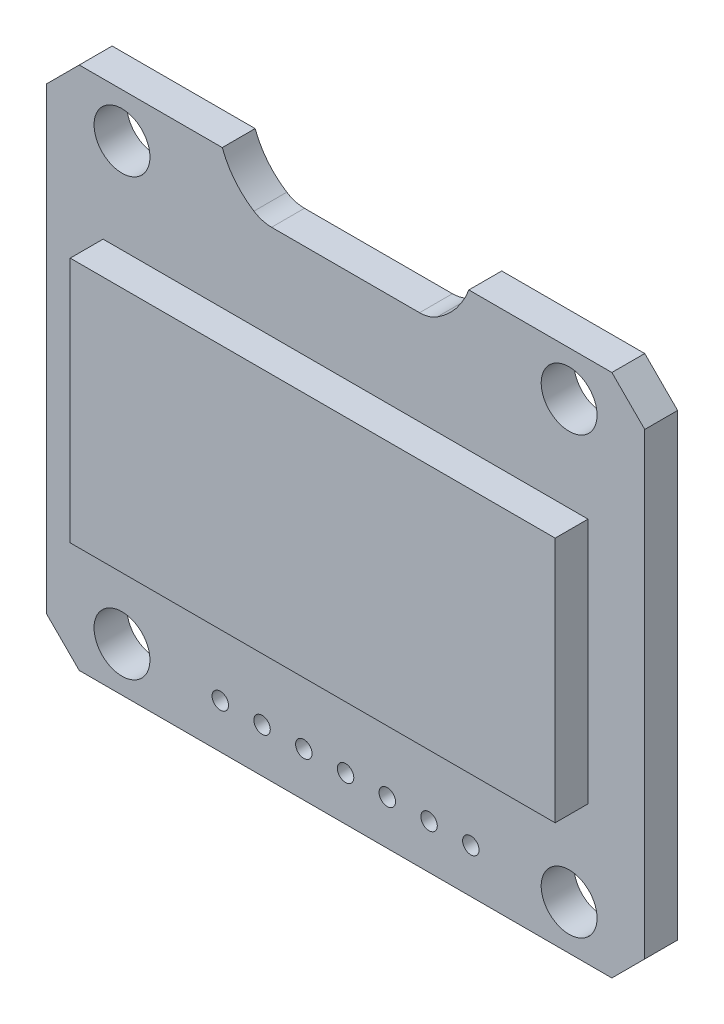
ISO-10303-21;
HEADER;
FILE_DESCRIPTION(('STEP AP214'),'2;1');
FILE_NAME('part.step','',(''),(''),'','','');
FILE_SCHEMA(('AUTOMOTIVE_DESIGN { 1 0 10303 214 1 1 1 1 }'));
ENDSEC;
DATA;
#1=APPLICATION_CONTEXT('core data for automotive mechanical design processes');
#2=APPLICATION_PROTOCOL_DEFINITION('international standard','automotive_design',2000,#1);
#3=PRODUCT_CONTEXT('',#1,'mechanical');
#4=PRODUCT('Part','Part','',(#3));
#5=PRODUCT_RELATED_PRODUCT_CATEGORY('part','',(#4));
#6=PRODUCT_DEFINITION_FORMATION('','',#4);
#7=PRODUCT_DEFINITION_CONTEXT('part definition',#1,'design');
#8=PRODUCT_DEFINITION('design','',#6,#7);
#9=PRODUCT_DEFINITION_SHAPE('','',#8);
#10=(LENGTH_UNIT() NAMED_UNIT(*) SI_UNIT(.MILLI.,.METRE.));
#11=(NAMED_UNIT(*) PLANE_ANGLE_UNIT() SI_UNIT($,.RADIAN.));
#12=(NAMED_UNIT(*) SI_UNIT($,.STERADIAN.) SOLID_ANGLE_UNIT());
#13=UNCERTAINTY_MEASURE_WITH_UNIT(LENGTH_MEASURE(1.E-05),#10,'distance_accuracy_value','');
#14=(GEOMETRIC_REPRESENTATION_CONTEXT(3) GLOBAL_UNCERTAINTY_ASSIGNED_CONTEXT((#13)) GLOBAL_UNIT_ASSIGNED_CONTEXT((#10,
#11,#12)) REPRESENTATION_CONTEXT('',''));
#15=CARTESIAN_POINT('',(0.,0.,0.));
#16=DIRECTION('',(0.,0.,1.));
#17=DIRECTION('',(1.,0.,0.));
#18=AXIS2_PLACEMENT_3D('',#15,#16,#17);
#19=CARTESIAN_POINT('',(-18.2,15.95,2.));
#20=DIRECTION('',(0.,-1.,0.));
#21=DIRECTION('',(0.,0.,-1.));
#22=AXIS2_PLACEMENT_3D('',#19,#20,#21);
#23=PLANE('',#22);
#24=DIRECTION('',(-1.,0.,0.));
#25=VECTOR('',#24,1.);
#26=CARTESIAN_POINT('',(-18.2,15.95,2.));
#27=LINE('',#26,#25);
#28=CARTESIAN_POINT('',(-7.5,15.95,2.));
#29=VERTEX_POINT('',#28);
#30=CARTESIAN_POINT('',(-16.2,15.95,2.));
#31=VERTEX_POINT('',#30);
#32=EDGE_CURVE('E191',#29,#31,#27,.T.);
#33=ORIENTED_EDGE('',*,*,#32,.F.);
#34=DIRECTION('',(0.,0.,1.));
#35=VECTOR('',#34,1.);
#36=CARTESIAN_POINT('',(-7.5,15.95,-8.));
#37=LINE('',#36,#35);
#38=CARTESIAN_POINT('',(-7.5,15.95,0.));
#39=VERTEX_POINT('',#38);
#40=EDGE_CURVE('E182',#39,#29,#37,.T.);
#41=ORIENTED_EDGE('',*,*,#40,.F.);
#42=DIRECTION('',(-1.,0.,0.));
#43=VECTOR('',#42,1.);
#44=CARTESIAN_POINT('',(-18.2,15.95,0.));
#45=LINE('',#44,#43);
#46=CARTESIAN_POINT('',(-16.2,15.95,0.));
#47=VERTEX_POINT('',#46);
#48=EDGE_CURVE('E206',#39,#47,#45,.T.);
#49=ORIENTED_EDGE('',*,*,#48,.T.);
#50=DIRECTION('',(0.,0.,1.));
#51=VECTOR('',#50,1.);
#52=CARTESIAN_POINT('',(-16.2,15.95,0.));
#53=LINE('',#52,#51);
#54=EDGE_CURVE('E328',#47,#31,#53,.T.);
#55=ORIENTED_EDGE('',*,*,#54,.T.);
#56=EDGE_LOOP('',(#33,#41,#49,#55));
#57=FACE_BOUND('',#56,.T.);
#58=ADVANCED_FACE('F41',(#57),#23,.F.);
#59=CARTESIAN_POINT('',(0.,0.,2.));
#60=DIRECTION('',(0.,0.,-1.));
#61=DIRECTION('',(-1.,0.,0.));
#62=AXIS2_PLACEMENT_3D('',#59,#60,#61);
#63=PLANE('',#62);
#64=CARTESIAN_POINT('',(-7.62,-13.25,2.));
#65=DIRECTION('',(0.,0.,1.));
#66=DIRECTION('',(1.,0.,0.));
#67=AXIS2_PLACEMENT_3D('',#64,#65,#66);
#68=CIRCLE('',#67,0.500000000000001);
#69=CARTESIAN_POINT('',(-7.12,-13.25,2.));
#70=VERTEX_POINT('',#69);
#71=EDGE_CURVE('E219',#70,#70,#68,.T.);
#72=ORIENTED_EDGE('',*,*,#71,.F.);
#73=EDGE_LOOP('',(#72));
#74=FACE_BOUND('',#73,.T.);
#75=CARTESIAN_POINT('',(-5.08,-13.25,2.));
#76=DIRECTION('',(0.,0.,1.));
#77=DIRECTION('',(1.,0.,0.));
#78=AXIS2_PLACEMENT_3D('',#75,#76,#77);
#79=CIRCLE('',#78,0.500000000000001);
#80=CARTESIAN_POINT('',(-4.58,-13.25,2.));
#81=VERTEX_POINT('',#80);
#82=EDGE_CURVE('E452',#81,#81,#79,.T.);
#83=ORIENTED_EDGE('',*,*,#82,.F.);
#84=EDGE_LOOP('',(#83));
#85=FACE_BOUND('',#84,.T.);
#86=CARTESIAN_POINT('',(-2.54,-13.25,2.));
#87=DIRECTION('',(0.,0.,1.));
#88=DIRECTION('',(1.,0.,0.));
#89=AXIS2_PLACEMENT_3D('',#86,#87,#88);
#90=CIRCLE('',#89,0.500000000000001);
#91=CARTESIAN_POINT('',(-2.04,-13.25,2.));
#92=VERTEX_POINT('',#91);
#93=EDGE_CURVE('E449',#92,#92,#90,.T.);
#94=ORIENTED_EDGE('',*,*,#93,.F.);
#95=EDGE_LOOP('',(#94));
#96=FACE_BOUND('',#95,.T.);
#97=CARTESIAN_POINT('',(0.,-13.25,2.));
#98=DIRECTION('',(0.,0.,1.));
#99=DIRECTION('',(1.,0.,0.));
#100=AXIS2_PLACEMENT_3D('',#97,#98,#99);
#101=CIRCLE('',#100,0.500000000000001);
#102=CARTESIAN_POINT('',(0.500000000000003,-13.25,2.));
#103=VERTEX_POINT('',#102);
#104=EDGE_CURVE('E446',#103,#103,#101,.T.);
#105=ORIENTED_EDGE('',*,*,#104,.F.);
#106=EDGE_LOOP('',(#105));
#107=FACE_BOUND('',#106,.T.);
#108=CARTESIAN_POINT('',(2.54,-13.25,2.));
#109=DIRECTION('',(0.,0.,1.));
#110=DIRECTION('',(1.,0.,0.));
#111=AXIS2_PLACEMENT_3D('',#108,#109,#110);
#112=CIRCLE('',#111,0.500000000000001);
#113=CARTESIAN_POINT('',(3.04,-13.25,2.));
#114=VERTEX_POINT('',#113);
#115=EDGE_CURVE('E443',#114,#114,#112,.T.);
#116=ORIENTED_EDGE('',*,*,#115,.F.);
#117=EDGE_LOOP('',(#116));
#118=FACE_BOUND('',#117,.T.);
#119=CARTESIAN_POINT('',(5.08,-13.25,2.));
#120=DIRECTION('',(0.,0.,1.));
#121=DIRECTION('',(1.,0.,0.));
#122=AXIS2_PLACEMENT_3D('',#119,#120,#121);
#123=CIRCLE('',#122,0.500000000000001);
#124=CARTESIAN_POINT('',(5.58,-13.25,2.));
#125=VERTEX_POINT('',#124);
#126=EDGE_CURVE('E440',#125,#125,#123,.T.);
#127=ORIENTED_EDGE('',*,*,#126,.F.);
#128=EDGE_LOOP('',(#127));
#129=FACE_BOUND('',#128,.T.);
#130=CARTESIAN_POINT('',(7.62,-13.25,2.));
#131=DIRECTION('',(0.,0.,1.));
#132=DIRECTION('',(1.,0.,0.));
#133=AXIS2_PLACEMENT_3D('',#130,#131,#132);
#134=CIRCLE('',#133,0.500000000000001);
#135=CARTESIAN_POINT('',(8.12,-13.25,2.));
#136=VERTEX_POINT('',#135);
#137=EDGE_CURVE('E437',#136,#136,#134,.T.);
#138=ORIENTED_EDGE('',*,*,#137,.F.);
#139=EDGE_LOOP('',(#138));
#140=FACE_BOUND('',#139,.T.);
#141=CARTESIAN_POINT('',(-13.6,-13.25,2.));
#142=DIRECTION('',(0.,0.,1.));
#143=DIRECTION('',(-1.,0.,0.));
#144=AXIS2_PLACEMENT_3D('',#141,#142,#143);
#145=CIRCLE('',#144,1.7);
#146=CARTESIAN_POINT('',(-15.3,-13.25,2.));
#147=VERTEX_POINT('',#146);
#148=EDGE_CURVE('E346',#147,#147,#145,.T.);
#149=ORIENTED_EDGE('',*,*,#148,.F.);
#150=EDGE_LOOP('',(#149));
#151=FACE_BOUND('',#150,.T.);
#152=CARTESIAN_POINT('',(13.6,-13.25,2.));
#153=DIRECTION('',(0.,0.,1.));
#154=DIRECTION('',(1.,0.,0.));
#155=AXIS2_PLACEMENT_3D('',#152,#153,#154);
#156=CIRCLE('',#155,1.7);
#157=CARTESIAN_POINT('',(15.3,-13.25,2.));
#158=VERTEX_POINT('',#157);
#159=EDGE_CURVE('E340',#158,#158,#156,.T.);
#160=ORIENTED_EDGE('',*,*,#159,.F.);
#161=EDGE_LOOP('',(#160));
#162=FACE_BOUND('',#161,.T.);
#163=CARTESIAN_POINT('',(13.6,13.25,2.));
#164=DIRECTION('',(0.,0.,1.));
#165=DIRECTION('',(-1.,0.,0.));
#166=AXIS2_PLACEMENT_3D('',#163,#164,#165);
#167=CIRCLE('',#166,1.7);
#168=CARTESIAN_POINT('',(11.9,13.25,2.));
#169=VERTEX_POINT('',#168);
#170=EDGE_CURVE('E333',#169,#169,#167,.T.);
#171=ORIENTED_EDGE('',*,*,#170,.F.);
#172=EDGE_LOOP('',(#171));
#173=FACE_BOUND('',#172,.T.);
#174=CARTESIAN_POINT('',(-13.6,13.25,2.));
#175=DIRECTION('',(0.,0.,1.));
#176=DIRECTION('',(1.,0.,0.));
#177=AXIS2_PLACEMENT_3D('',#174,#175,#176);
#178=CIRCLE('',#177,1.7);
#179=CARTESIAN_POINT('',(-11.9,13.25,2.));
#180=VERTEX_POINT('',#179);
#181=EDGE_CURVE('E336',#180,#180,#178,.T.);
#182=ORIENTED_EDGE('',*,*,#181,.F.);
#183=EDGE_LOOP('',(#182));
#184=FACE_BOUND('',#183,.T.);
#185=DIRECTION('',(1.,0.,0.));
#186=VECTOR('',#185,1.);
#187=CARTESIAN_POINT('',(-5.,13.25,2.));
#188=LINE('',#187,#186);
#189=CARTESIAN_POINT('',(-4.50080011335944,13.25,2.));
#190=VERTEX_POINT('',#189);
#191=CARTESIAN_POINT('',(4.50080011335943,13.25,2.));
#192=VERTEX_POINT('',#191);
#193=EDGE_CURVE('E172',#190,#192,#188,.T.);
#194=ORIENTED_EDGE('',*,*,#193,.F.);
#195=CARTESIAN_POINT('',(-4.50080011335943,15.25,2.));
#196=DIRECTION('',(0.,0.,-1.));
#197=DIRECTION('',(-1.,0.,0.));
#198=AXIS2_PLACEMENT_3D('',#195,#196,#197);
#199=CIRCLE('',#198,2.);
#200=CARTESIAN_POINT('',(-5.5742727633345,13.5624999348873,2.));
#201=VERTEX_POINT('',#200);
#202=EDGE_CURVE('E252',#190,#201,#199,.T.);
#203=ORIENTED_EDGE('',*,*,#202,.T.);
#204=CARTESIAN_POINT('',(-3.,17.6092592592593,2.));
#205=DIRECTION('',(0.,0.,1.));
#206=DIRECTION('',(1.,0.,0.));
#207=AXIS2_PLACEMENT_3D('',#204,#205,#206);
#208=CIRCLE('',#207,4.79615901419434);
#209=EDGE_CURVE('E259',#29,#201,#208,.T.);
#210=ORIENTED_EDGE('',*,*,#209,.F.);
#211=ORIENTED_EDGE('',*,*,#32,.T.);
#212=DIRECTION('',(0.707106781186547,0.707106781186548,0.));
#213=VECTOR('',#212,1.);
#214=CARTESIAN_POINT('',(-16.2,15.95,2.));
#215=LINE('',#214,#213);
#216=CARTESIAN_POINT('',(-18.2,13.95,2.));
#217=VERTEX_POINT('',#216);
#218=EDGE_CURVE('E325',#217,#31,#215,.T.);
#219=ORIENTED_EDGE('',*,*,#218,.F.);
#220=DIRECTION('',(0.,-1.,0.));
#221=VECTOR('',#220,1.);
#222=CARTESIAN_POINT('',(-18.2,-15.95,2.));
#223=LINE('',#222,#221);
#224=CARTESIAN_POINT('',(-18.2,-13.95,2.));
#225=VERTEX_POINT('',#224);
#226=EDGE_CURVE('E190',#217,#225,#223,.T.);
#227=ORIENTED_EDGE('',*,*,#226,.T.);
#228=DIRECTION('',(-0.707106781186547,0.707106781186548,0.));
#229=VECTOR('',#228,1.);
#230=CARTESIAN_POINT('',(-16.2,-15.95,2.));
#231=LINE('',#230,#229);
#232=CARTESIAN_POINT('',(-16.2,-15.95,2.));
#233=VERTEX_POINT('',#232);
#234=EDGE_CURVE('E317',#233,#225,#231,.T.);
#235=ORIENTED_EDGE('',*,*,#234,.F.);
#236=DIRECTION('',(1.,0.,0.));
#237=VECTOR('',#236,1.);
#238=CARTESIAN_POINT('',(-18.2,-15.95,2.));
#239=LINE('',#238,#237);
#240=CARTESIAN_POINT('',(16.2,-15.95,2.));
#241=VERTEX_POINT('',#240);
#242=EDGE_CURVE('E194',#233,#241,#239,.T.);
#243=ORIENTED_EDGE('',*,*,#242,.T.);
#244=DIRECTION('',(-0.707106781186547,-0.707106781186548,0.));
#245=VECTOR('',#244,1.);
#246=CARTESIAN_POINT('',(16.2,-15.95,2.));
#247=LINE('',#246,#245);
#248=CARTESIAN_POINT('',(18.2,-13.95,2.));
#249=VERTEX_POINT('',#248);
#250=EDGE_CURVE('E297',#249,#241,#247,.T.);
#251=ORIENTED_EDGE('',*,*,#250,.F.);
#252=DIRECTION('',(0.,1.,0.));
#253=VECTOR('',#252,1.);
#254=CARTESIAN_POINT('',(18.2,-15.95,2.));
#255=LINE('',#254,#253);
#256=CARTESIAN_POINT('',(18.2,13.95,2.));
#257=VERTEX_POINT('',#256);
#258=EDGE_CURVE('E196',#249,#257,#255,.T.);
#259=ORIENTED_EDGE('',*,*,#258,.T.);
#260=DIRECTION('',(0.707106781186547,-0.707106781186548,0.));
#261=VECTOR('',#260,1.);
#262=CARTESIAN_POINT('',(16.2,15.95,2.));
#263=LINE('',#262,#261);
#264=CARTESIAN_POINT('',(16.2,15.95,2.));
#265=VERTEX_POINT('',#264);
#266=EDGE_CURVE('E189',#265,#257,#263,.T.);
#267=ORIENTED_EDGE('',*,*,#266,.F.);
#268=CARTESIAN_POINT('',(7.5,15.95,2.));
#269=VERTEX_POINT('',#268);
#270=EDGE_CURVE('E179',#265,#269,#27,.T.);
#271=ORIENTED_EDGE('',*,*,#270,.T.);
#272=CARTESIAN_POINT('',(3.,17.6092592592593,2.));
#273=DIRECTION('',(0.,0.,1.));
#274=DIRECTION('',(-1.,0.,0.));
#275=AXIS2_PLACEMENT_3D('',#272,#273,#274);
#276=CIRCLE('',#275,4.79615901419434);
#277=CARTESIAN_POINT('',(5.5742727633345,13.5624999348873,2.));
#278=VERTEX_POINT('',#277);
#279=EDGE_CURVE('E165',#278,#269,#276,.T.);
#280=ORIENTED_EDGE('',*,*,#279,.F.);
#281=CARTESIAN_POINT('',(4.50080011335944,15.25,2.));
#282=DIRECTION('',(0.,0.,-1.));
#283=DIRECTION('',(-1.,0.,0.));
#284=AXIS2_PLACEMENT_3D('',#281,#282,#283);
#285=CIRCLE('',#284,2.);
#286=EDGE_CURVE('E49',#278,#192,#285,.T.);
#287=ORIENTED_EDGE('',*,*,#286,.T.);
#288=EDGE_LOOP('',(#194,#203,#210,#211,#219,#227,#235,#243,#251,#259,#267,#271,#280,#287));
#289=FACE_BOUND('',#288,.T.);
#290=DIRECTION('',(0.,1.,0.));
#291=VECTOR('',#290,1.);
#292=CARTESIAN_POINT('',(14.75,-7.5,2.));
#293=LINE('',#292,#291);
#294=CARTESIAN_POINT('',(14.75,-7.5,2.));
#295=VERTEX_POINT('',#294);
#296=CARTESIAN_POINT('',(14.75,7.5,2.));
#297=VERTEX_POINT('',#296);
#298=EDGE_CURVE('E354',#295,#297,#293,.T.);
#299=ORIENTED_EDGE('',*,*,#298,.F.);
#300=DIRECTION('',(1.,0.,0.));
#301=VECTOR('',#300,1.);
#302=CARTESIAN_POINT('',(-14.75,-7.5,2.));
#303=LINE('',#302,#301);
#304=CARTESIAN_POINT('',(-14.75,-7.5,2.));
#305=VERTEX_POINT('',#304);
#306=EDGE_CURVE('E361',#305,#295,#303,.T.);
#307=ORIENTED_EDGE('',*,*,#306,.F.);
#308=DIRECTION('',(0.,-1.,0.));
#309=VECTOR('',#308,1.);
#310=CARTESIAN_POINT('',(-14.75,-7.5,2.));
#311=LINE('',#310,#309);
#312=CARTESIAN_POINT('',(-14.75,7.5,2.));
#313=VERTEX_POINT('',#312);
#314=EDGE_CURVE('E373',#313,#305,#311,.T.);
#315=ORIENTED_EDGE('',*,*,#314,.F.);
#316=DIRECTION('',(-1.,0.,0.));
#317=VECTOR('',#316,1.);
#318=CARTESIAN_POINT('',(-14.75,7.5,2.));
#319=LINE('',#318,#317);
#320=EDGE_CURVE('E370',#297,#313,#319,.T.);
#321=ORIENTED_EDGE('',*,*,#320,.F.);
#322=EDGE_LOOP('',(#299,#307,#315,#321));
#323=FACE_BOUND('',#322,.T.);
#324=ADVANCED_FACE('F186',(#74,#85,#96,#107,#118,#129,#140,#151,#162,#173,#184,#289,#323),#63,.F.);
#325=CARTESIAN_POINT('',(18.2,-15.95,2.));
#326=DIRECTION('',(-1.,0.,0.));
#327=DIRECTION('',(0.,0.,1.));
#328=AXIS2_PLACEMENT_3D('',#325,#326,#327);
#329=PLANE('',#328);
#330=ORIENTED_EDGE('',*,*,#258,.F.);
#331=DIRECTION('',(0.,0.,1.));
#332=VECTOR('',#331,1.);
#333=CARTESIAN_POINT('',(18.2,-13.95,0.));
#334=LINE('',#333,#332);
#335=CARTESIAN_POINT('',(18.2,-13.95,0.));
#336=VERTEX_POINT('',#335);
#337=EDGE_CURVE('E293',#336,#249,#334,.T.);
#338=ORIENTED_EDGE('',*,*,#337,.F.);
#339=DIRECTION('',(0.,1.,0.));
#340=VECTOR('',#339,1.);
#341=CARTESIAN_POINT('',(18.2,-15.95,0.));
#342=LINE('',#341,#340);
#343=CARTESIAN_POINT('',(18.2,13.95,0.));
#344=VERTEX_POINT('',#343);
#345=EDGE_CURVE('E203',#336,#344,#342,.T.);
#346=ORIENTED_EDGE('',*,*,#345,.T.);
#347=DIRECTION('',(0.,0.,1.));
#348=VECTOR('',#347,1.);
#349=CARTESIAN_POINT('',(18.2,13.95,0.));
#350=LINE('',#349,#348);
#351=EDGE_CURVE('E295',#344,#257,#350,.T.);
#352=ORIENTED_EDGE('',*,*,#351,.T.);
#353=EDGE_LOOP('',(#330,#338,#346,#352));
#354=FACE_BOUND('',#353,.T.);
#355=ADVANCED_FACE('F273',(#354),#329,.F.);
#356=CARTESIAN_POINT('',(16.2,15.95,0.));
#357=VERTEX_POINT('',#356);
#358=CARTESIAN_POINT('',(7.5,15.95,0.));
#359=VERTEX_POINT('',#358);
#360=EDGE_CURVE('E181',#357,#359,#45,.T.);
#361=ORIENTED_EDGE('',*,*,#360,.T.);
#362=DIRECTION('',(0.,0.,1.));
#363=VECTOR('',#362,1.);
#364=CARTESIAN_POINT('',(7.5,15.95,-8.));
#365=LINE('',#364,#363);
#366=EDGE_CURVE('E168',#359,#269,#365,.T.);
#367=ORIENTED_EDGE('',*,*,#366,.T.);
#368=ORIENTED_EDGE('',*,*,#270,.F.);
#369=DIRECTION('',(0.,0.,1.));
#370=VECTOR('',#369,1.);
#371=CARTESIAN_POINT('',(16.2,15.95,0.));
#372=LINE('',#371,#370);
#373=EDGE_CURVE('E302',#357,#265,#372,.T.);
#374=ORIENTED_EDGE('',*,*,#373,.F.);
#375=EDGE_LOOP('',(#361,#367,#368,#374));
#376=FACE_BOUND('',#375,.T.);
#377=ADVANCED_FACE('F177',(#376),#23,.F.);
#378=CARTESIAN_POINT('',(-18.2,-15.95,2.));
#379=DIRECTION('',(1.,0.,0.));
#380=DIRECTION('',(0.,0.,-1.));
#381=AXIS2_PLACEMENT_3D('',#378,#379,#380);
#382=PLANE('',#381);
#383=DIRECTION('',(0.,-1.,0.));
#384=VECTOR('',#383,1.);
#385=CARTESIAN_POINT('',(-18.2,-15.95,0.));
#386=LINE('',#385,#384);
#387=CARTESIAN_POINT('',(-18.2,13.95,0.));
#388=VERTEX_POINT('',#387);
#389=CARTESIAN_POINT('',(-18.2,-13.95,0.));
#390=VERTEX_POINT('',#389);
#391=EDGE_CURVE('E209',#388,#390,#386,.T.);
#392=ORIENTED_EDGE('',*,*,#391,.T.);
#393=DIRECTION('',(0.,0.,1.));
#394=VECTOR('',#393,1.);
#395=CARTESIAN_POINT('',(-18.2,-13.95,0.));
#396=LINE('',#395,#394);
#397=EDGE_CURVE('E312',#390,#225,#396,.T.);
#398=ORIENTED_EDGE('',*,*,#397,.T.);
#399=ORIENTED_EDGE('',*,*,#226,.F.);
#400=DIRECTION('',(0.,0.,1.));
#401=VECTOR('',#400,1.);
#402=CARTESIAN_POINT('',(-18.2,13.95,0.));
#403=LINE('',#402,#401);
#404=EDGE_CURVE('E324',#388,#217,#403,.T.);
#405=ORIENTED_EDGE('',*,*,#404,.F.);
#406=EDGE_LOOP('',(#392,#398,#399,#405));
#407=FACE_BOUND('',#406,.T.);
#408=ADVANCED_FACE('F280',(#407),#382,.F.);
#409=CARTESIAN_POINT('',(-18.2,-15.95,2.));
#410=DIRECTION('',(0.,1.,0.));
#411=DIRECTION('',(0.,0.,1.));
#412=AXIS2_PLACEMENT_3D('',#409,#410,#411);
#413=PLANE('',#412);
#414=ORIENTED_EDGE('',*,*,#242,.F.);
#415=DIRECTION('',(0.,0.,1.));
#416=VECTOR('',#415,1.);
#417=CARTESIAN_POINT('',(-16.2,-15.95,0.));
#418=LINE('',#417,#416);
#419=CARTESIAN_POINT('',(-16.2,-15.95,0.));
#420=VERTEX_POINT('',#419);
#421=EDGE_CURVE('E237',#420,#233,#418,.T.);
#422=ORIENTED_EDGE('',*,*,#421,.F.);
#423=DIRECTION('',(1.,0.,0.));
#424=VECTOR('',#423,1.);
#425=CARTESIAN_POINT('',(-18.2,-15.95,0.));
#426=LINE('',#425,#424);
#427=CARTESIAN_POINT('',(16.2,-15.95,0.));
#428=VERTEX_POINT('',#427);
#429=EDGE_CURVE('E212',#420,#428,#426,.T.);
#430=ORIENTED_EDGE('',*,*,#429,.T.);
#431=DIRECTION('',(0.,0.,1.));
#432=VECTOR('',#431,1.);
#433=CARTESIAN_POINT('',(16.2,-15.95,0.));
#434=LINE('',#433,#432);
#435=EDGE_CURVE('E309',#428,#241,#434,.T.);
#436=ORIENTED_EDGE('',*,*,#435,.T.);
#437=EDGE_LOOP('',(#414,#422,#430,#436));
#438=FACE_BOUND('',#437,.T.);
#439=ADVANCED_FACE('F285',(#438),#413,.F.);
#440=CARTESIAN_POINT('',(0.,0.,0.));
#441=DIRECTION('',(0.,0.,-1.));
#442=DIRECTION('',(-1.,0.,0.));
#443=AXIS2_PLACEMENT_3D('',#440,#441,#442);
#444=PLANE('',#443);
#445=CARTESIAN_POINT('',(-3.,17.6092592592593,0.));
#446=DIRECTION('',(0.,0.,-1.));
#447=DIRECTION('',(-1.,0.,0.));
#448=AXIS2_PLACEMENT_3D('',#445,#446,#447);
#449=CIRCLE('',#448,4.79615901419434);
#450=CARTESIAN_POINT('',(-5.5742727633345,13.5624999348873,0.));
#451=VERTEX_POINT('',#450);
#452=EDGE_CURVE('E242',#451,#39,#449,.T.);
#453=ORIENTED_EDGE('',*,*,#452,.F.);
#454=CARTESIAN_POINT('',(-4.50080011335943,15.25,0.));
#455=DIRECTION('',(0.,0.,-1.));
#456=DIRECTION('',(-1.,0.,0.));
#457=AXIS2_PLACEMENT_3D('',#454,#455,#456);
#458=CIRCLE('',#457,2.);
#459=CARTESIAN_POINT('',(-4.50080011335944,13.25,0.));
#460=VERTEX_POINT('',#459);
#461=EDGE_CURVE('E254',#451,#460,#458,.F.);
#462=ORIENTED_EDGE('',*,*,#461,.T.);
#463=DIRECTION('',(-1.,0.,0.));
#464=VECTOR('',#463,1.);
#465=CARTESIAN_POINT('',(0.,13.25,0.));
#466=LINE('',#465,#464);
#467=CARTESIAN_POINT('',(4.50080011335943,13.25,0.));
#468=VERTEX_POINT('',#467);
#469=EDGE_CURVE('E202',#468,#460,#466,.T.);
#470=ORIENTED_EDGE('',*,*,#469,.F.);
#471=CARTESIAN_POINT('',(4.50080011335944,15.25,0.));
#472=DIRECTION('',(0.,0.,-1.));
#473=DIRECTION('',(-1.,0.,0.));
#474=AXIS2_PLACEMENT_3D('',#471,#472,#473);
#475=CIRCLE('',#474,2.);
#476=CARTESIAN_POINT('',(5.5742727633345,13.5624999348873,0.));
#477=VERTEX_POINT('',#476);
#478=EDGE_CURVE('E11',#468,#477,#475,.F.);
#479=ORIENTED_EDGE('',*,*,#478,.T.);
#480=CARTESIAN_POINT('',(3.,17.6092592592593,0.));
#481=DIRECTION('',(0.,0.,-1.));
#482=DIRECTION('',(-1.,0.,0.));
#483=AXIS2_PLACEMENT_3D('',#480,#481,#482);
#484=CIRCLE('',#483,4.79615901419434);
#485=EDGE_CURVE('E240',#359,#477,#484,.T.);
#486=ORIENTED_EDGE('',*,*,#485,.F.);
#487=ORIENTED_EDGE('',*,*,#360,.F.);
#488=DIRECTION('',(0.707106781186547,-0.707106781186548,0.));
#489=VECTOR('',#488,1.);
#490=CARTESIAN_POINT('',(16.2,15.95,0.));
#491=LINE('',#490,#489);
#492=EDGE_CURVE('E432',#357,#344,#491,.T.);
#493=ORIENTED_EDGE('',*,*,#492,.T.);
#494=ORIENTED_EDGE('',*,*,#345,.F.);
#495=DIRECTION('',(-0.707106781186547,-0.707106781186548,0.));
#496=VECTOR('',#495,1.);
#497=CARTESIAN_POINT('',(16.2,-15.95,0.));
#498=LINE('',#497,#496);
#499=EDGE_CURVE('E303',#336,#428,#498,.T.);
#500=ORIENTED_EDGE('',*,*,#499,.T.);
#501=ORIENTED_EDGE('',*,*,#429,.F.);
#502=DIRECTION('',(-0.707106781186547,0.707106781186548,0.));
#503=VECTOR('',#502,1.);
#504=CARTESIAN_POINT('',(-16.2,-15.95,0.));
#505=LINE('',#504,#503);
#506=EDGE_CURVE('E315',#420,#390,#505,.T.);
#507=ORIENTED_EDGE('',*,*,#506,.T.);
#508=ORIENTED_EDGE('',*,*,#391,.F.);
#509=DIRECTION('',(0.707106781186547,0.707106781186548,0.));
#510=VECTOR('',#509,1.);
#511=CARTESIAN_POINT('',(-16.2,15.95,0.));
#512=LINE('',#511,#510);
#513=EDGE_CURVE('E321',#388,#47,#512,.T.);
#514=ORIENTED_EDGE('',*,*,#513,.T.);
#515=ORIENTED_EDGE('',*,*,#48,.F.);
#516=EDGE_LOOP('',(#453,#462,#470,#479,#486,#487,#493,#494,#500,#501,#507,#508,#514,#515));
#517=FACE_BOUND('',#516,.T.);
#518=CARTESIAN_POINT('',(-7.62,-13.25,0.));
#519=DIRECTION('',(0.,0.,-1.));
#520=DIRECTION('',(-1.,0.,0.));
#521=AXIS2_PLACEMENT_3D('',#518,#519,#520);
#522=CIRCLE('',#521,0.500000000000001);
#523=CARTESIAN_POINT('',(-8.12,-13.25,0.));
#524=VERTEX_POINT('',#523);
#525=EDGE_CURVE('E234',#524,#524,#522,.T.);
#526=ORIENTED_EDGE('',*,*,#525,.F.);
#527=EDGE_LOOP('',(#526));
#528=FACE_BOUND('',#527,.T.);
#529=CARTESIAN_POINT('',(-5.08,-13.25,0.));
#530=DIRECTION('',(0.,0.,-1.));
#531=DIRECTION('',(-1.,0.,0.));
#532=AXIS2_PLACEMENT_3D('',#529,#530,#531);
#533=CIRCLE('',#532,0.500000000000001);
#534=CARTESIAN_POINT('',(-5.58,-13.25,0.));
#535=VERTEX_POINT('',#534);
#536=EDGE_CURVE('E231',#535,#535,#533,.T.);
#537=ORIENTED_EDGE('',*,*,#536,.F.);
#538=EDGE_LOOP('',(#537));
#539=FACE_BOUND('',#538,.T.);
#540=CARTESIAN_POINT('',(-2.54,-13.25,0.));
#541=DIRECTION('',(0.,0.,-1.));
#542=DIRECTION('',(-1.,0.,0.));
#543=AXIS2_PLACEMENT_3D('',#540,#541,#542);
#544=CIRCLE('',#543,0.500000000000001);
#545=CARTESIAN_POINT('',(-3.04,-13.25,0.));
#546=VERTEX_POINT('',#545);
#547=EDGE_CURVE('E228',#546,#546,#544,.T.);
#548=ORIENTED_EDGE('',*,*,#547,.F.);
#549=EDGE_LOOP('',(#548));
#550=FACE_BOUND('',#549,.T.);
#551=CARTESIAN_POINT('',(0.,-13.25,0.));
#552=DIRECTION('',(0.,0.,-1.));
#553=DIRECTION('',(-1.,0.,0.));
#554=AXIS2_PLACEMENT_3D('',#551,#552,#553);
#555=CIRCLE('',#554,0.500000000000001);
#556=CARTESIAN_POINT('',(-0.5,-13.25,0.));
#557=VERTEX_POINT('',#556);
#558=EDGE_CURVE('E225',#557,#557,#555,.T.);
#559=ORIENTED_EDGE('',*,*,#558,.F.);
#560=EDGE_LOOP('',(#559));
#561=FACE_BOUND('',#560,.T.);
#562=CARTESIAN_POINT('',(2.54,-13.25,0.));
#563=DIRECTION('',(0.,0.,-1.));
#564=DIRECTION('',(-1.,0.,0.));
#565=AXIS2_PLACEMENT_3D('',#562,#563,#564);
#566=CIRCLE('',#565,0.500000000000001);
#567=CARTESIAN_POINT('',(2.04,-13.25,0.));
#568=VERTEX_POINT('',#567);
#569=EDGE_CURVE('E222',#568,#568,#566,.T.);
#570=ORIENTED_EDGE('',*,*,#569,.F.);
#571=EDGE_LOOP('',(#570));
#572=FACE_BOUND('',#571,.T.);
#573=CARTESIAN_POINT('',(5.08,-13.25,0.));
#574=DIRECTION('',(0.,0.,-1.));
#575=DIRECTION('',(-1.,0.,0.));
#576=AXIS2_PLACEMENT_3D('',#573,#574,#575);
#577=CIRCLE('',#576,0.500000000000001);
#578=CARTESIAN_POINT('',(4.58,-13.25,0.));
#579=VERTEX_POINT('',#578);
#580=EDGE_CURVE('E218',#579,#579,#577,.T.);
#581=ORIENTED_EDGE('',*,*,#580,.F.);
#582=EDGE_LOOP('',(#581));
#583=FACE_BOUND('',#582,.T.);
#584=CARTESIAN_POINT('',(7.62,-13.25,0.));
#585=DIRECTION('',(0.,0.,-1.));
#586=DIRECTION('',(-1.,0.,0.));
#587=AXIS2_PLACEMENT_3D('',#584,#585,#586);
#588=CIRCLE('',#587,0.500000000000001);
#589=CARTESIAN_POINT('',(7.12,-13.25,0.));
#590=VERTEX_POINT('',#589);
#591=EDGE_CURVE('E215',#590,#590,#588,.T.);
#592=ORIENTED_EDGE('',*,*,#591,.F.);
#593=EDGE_LOOP('',(#592));
#594=FACE_BOUND('',#593,.T.);
#595=CARTESIAN_POINT('',(-13.6,-13.25,0.));
#596=DIRECTION('',(0.,0.,1.));
#597=DIRECTION('',(-1.,0.,0.));
#598=AXIS2_PLACEMENT_3D('',#595,#596,#597);
#599=CIRCLE('',#598,1.7);
#600=CARTESIAN_POINT('',(-15.3,-13.25,0.));
#601=VERTEX_POINT('',#600);
#602=EDGE_CURVE('E331',#601,#601,#599,.T.);
#603=ORIENTED_EDGE('',*,*,#602,.T.);
#604=EDGE_LOOP('',(#603));
#605=FACE_BOUND('',#604,.T.);
#606=CARTESIAN_POINT('',(13.6,-13.25,0.));
#607=DIRECTION('',(0.,0.,1.));
#608=DIRECTION('',(1.,0.,0.));
#609=AXIS2_PLACEMENT_3D('',#606,#607,#608);
#610=CIRCLE('',#609,1.7);
#611=CARTESIAN_POINT('',(15.3,-13.25,0.));
#612=VERTEX_POINT('',#611);
#613=EDGE_CURVE('E343',#612,#612,#610,.T.);
#614=ORIENTED_EDGE('',*,*,#613,.T.);
#615=EDGE_LOOP('',(#614));
#616=FACE_BOUND('',#615,.T.);
#617=CARTESIAN_POINT('',(13.6,13.25,0.));
#618=DIRECTION('',(0.,0.,1.));
#619=DIRECTION('',(-1.,0.,0.));
#620=AXIS2_PLACEMENT_3D('',#617,#618,#619);
#621=CIRCLE('',#620,1.7);
#622=CARTESIAN_POINT('',(11.9,13.25,0.));
#623=VERTEX_POINT('',#622);
#624=EDGE_CURVE('E337',#623,#623,#621,.T.);
#625=ORIENTED_EDGE('',*,*,#624,.T.);
#626=EDGE_LOOP('',(#625));
#627=FACE_BOUND('',#626,.T.);
#628=CARTESIAN_POINT('',(-13.6,13.25,0.));
#629=DIRECTION('',(0.,0.,1.));
#630=DIRECTION('',(1.,0.,0.));
#631=AXIS2_PLACEMENT_3D('',#628,#629,#630);
#632=CIRCLE('',#631,1.7);
#633=CARTESIAN_POINT('',(-11.9,13.25,0.));
#634=VERTEX_POINT('',#633);
#635=EDGE_CURVE('E351',#634,#634,#632,.T.);
#636=ORIENTED_EDGE('',*,*,#635,.T.);
#637=EDGE_LOOP('',(#636));
#638=FACE_BOUND('',#637,.T.);
#639=ADVANCED_FACE('F421',(#517,#528,#539,#550,#561,#572,#583,#594,#605,#616,#627,#638),#444,.T.);
#640=CARTESIAN_POINT('',(14.75,-7.5,4.));
#641=DIRECTION('',(-1.,0.,0.));
#642=DIRECTION('',(0.,0.,1.));
#643=AXIS2_PLACEMENT_3D('',#640,#641,#642);
#644=PLANE('',#643);
#645=ORIENTED_EDGE('',*,*,#298,.T.);
#646=DIRECTION('',(0.,0.,-1.));
#647=VECTOR('',#646,1.);
#648=CARTESIAN_POINT('',(14.75,7.5,4.));
#649=LINE('',#648,#647);
#650=CARTESIAN_POINT('',(14.75,7.5,4.));
#651=VERTEX_POINT('',#650);
#652=EDGE_CURVE('E207',#651,#297,#649,.T.);
#653=ORIENTED_EDGE('',*,*,#652,.F.);
#654=DIRECTION('',(0.,1.,0.));
#655=VECTOR('',#654,1.);
#656=CARTESIAN_POINT('',(14.75,-7.5,4.));
#657=LINE('',#656,#655);
#658=CARTESIAN_POINT('',(14.75,-7.5,4.));
#659=VERTEX_POINT('',#658);
#660=EDGE_CURVE('E357',#659,#651,#657,.T.);
#661=ORIENTED_EDGE('',*,*,#660,.F.);
#662=DIRECTION('',(0.,0.,-1.));
#663=VECTOR('',#662,1.);
#664=CARTESIAN_POINT('',(14.75,-7.5,4.));
#665=LINE('',#664,#663);
#666=EDGE_CURVE('E367',#659,#295,#665,.T.);
#667=ORIENTED_EDGE('',*,*,#666,.T.);
#668=EDGE_LOOP('',(#645,#653,#661,#667));
#669=FACE_BOUND('',#668,.T.);
#670=ADVANCED_FACE('F392',(#669),#644,.F.);
#671=CARTESIAN_POINT('',(-14.75,7.5,4.));
#672=DIRECTION('',(0.,-1.,0.));
#673=DIRECTION('',(0.,0.,-1.));
#674=AXIS2_PLACEMENT_3D('',#671,#672,#673);
#675=PLANE('',#674);
#676=ORIENTED_EDGE('',*,*,#320,.T.);
#677=DIRECTION('',(0.,0.,-1.));
#678=VECTOR('',#677,1.);
#679=CARTESIAN_POINT('',(-14.75,7.5,4.));
#680=LINE('',#679,#678);
#681=CARTESIAN_POINT('',(-14.75,7.5,4.));
#682=VERTEX_POINT('',#681);
#683=EDGE_CURVE('E383',#682,#313,#680,.T.);
#684=ORIENTED_EDGE('',*,*,#683,.F.);
#685=DIRECTION('',(-1.,0.,0.));
#686=VECTOR('',#685,1.);
#687=CARTESIAN_POINT('',(-14.75,7.5,4.));
#688=LINE('',#687,#686);
#689=EDGE_CURVE('E360',#651,#682,#688,.T.);
#690=ORIENTED_EDGE('',*,*,#689,.F.);
#691=ORIENTED_EDGE('',*,*,#652,.T.);
#692=EDGE_LOOP('',(#676,#684,#690,#691));
#693=FACE_BOUND('',#692,.T.);
#694=ADVANCED_FACE('F388',(#693),#675,.F.);
#695=CARTESIAN_POINT('',(-14.75,-7.5,4.));
#696=DIRECTION('',(1.,0.,0.));
#697=DIRECTION('',(0.,0.,-1.));
#698=AXIS2_PLACEMENT_3D('',#695,#696,#697);
#699=PLANE('',#698);
#700=ORIENTED_EDGE('',*,*,#314,.T.);
#701=DIRECTION('',(0.,0.,-1.));
#702=VECTOR('',#701,1.);
#703=CARTESIAN_POINT('',(-14.75,-7.5,4.));
#704=LINE('',#703,#702);
#705=CARTESIAN_POINT('',(-14.75,-7.5,4.));
#706=VERTEX_POINT('',#705);
#707=EDGE_CURVE('E380',#706,#305,#704,.T.);
#708=ORIENTED_EDGE('',*,*,#707,.F.);
#709=DIRECTION('',(0.,-1.,0.));
#710=VECTOR('',#709,1.);
#711=CARTESIAN_POINT('',(-14.75,-7.5,4.));
#712=LINE('',#711,#710);
#713=EDGE_CURVE('E363',#682,#706,#712,.T.);
#714=ORIENTED_EDGE('',*,*,#713,.F.);
#715=ORIENTED_EDGE('',*,*,#683,.T.);
#716=EDGE_LOOP('',(#700,#708,#714,#715));
#717=FACE_BOUND('',#716,.T.);
#718=ADVANCED_FACE('F400',(#717),#699,.F.);
#719=CARTESIAN_POINT('',(-14.75,-7.5,4.));
#720=DIRECTION('',(0.,1.,0.));
#721=DIRECTION('',(0.,0.,1.));
#722=AXIS2_PLACEMENT_3D('',#719,#720,#721);
#723=PLANE('',#722);
#724=ORIENTED_EDGE('',*,*,#306,.T.);
#725=ORIENTED_EDGE('',*,*,#666,.F.);
#726=DIRECTION('',(1.,0.,0.));
#727=VECTOR('',#726,1.);
#728=CARTESIAN_POINT('',(-14.75,-7.5,4.));
#729=LINE('',#728,#727);
#730=EDGE_CURVE('E365',#706,#659,#729,.T.);
#731=ORIENTED_EDGE('',*,*,#730,.F.);
#732=ORIENTED_EDGE('',*,*,#707,.T.);
#733=EDGE_LOOP('',(#724,#725,#731,#732));
#734=FACE_BOUND('',#733,.T.);
#735=ADVANCED_FACE('F395',(#734),#723,.F.);
#736=CARTESIAN_POINT('',(0.,0.,4.));
#737=DIRECTION('',(0.,0.,-1.));
#738=DIRECTION('',(-1.,0.,0.));
#739=AXIS2_PLACEMENT_3D('',#736,#737,#738);
#740=PLANE('',#739);
#741=ORIENTED_EDGE('',*,*,#660,.T.);
#742=ORIENTED_EDGE('',*,*,#689,.T.);
#743=ORIENTED_EDGE('',*,*,#713,.T.);
#744=ORIENTED_EDGE('',*,*,#730,.T.);
#745=EDGE_LOOP('',(#741,#742,#743,#744));
#746=FACE_BOUND('',#745,.T.);
#747=ADVANCED_FACE('F402',(#746),#740,.F.);
#748=CARTESIAN_POINT('',(-13.6,13.25,0.));
#749=DIRECTION('',(0.,0.,1.));
#750=DIRECTION('',(1.,0.,0.));
#751=AXIS2_PLACEMENT_3D('',#748,#749,#750);
#752=CYLINDRICAL_SURFACE('',#751,1.7);
#753=ORIENTED_EDGE('',*,*,#635,.F.);
#754=EDGE_LOOP('',(#753));
#755=FACE_BOUND('',#754,.T.);
#756=ORIENTED_EDGE('',*,*,#181,.T.);
#757=EDGE_LOOP('',(#756));
#758=FACE_BOUND('',#757,.T.);
#759=ADVANCED_FACE('F404',(#755,#758),#752,.F.);
#760=CARTESIAN_POINT('',(13.6,13.25,0.));
#761=DIRECTION('',(0.,0.,1.));
#762=DIRECTION('',(1.,0.,0.));
#763=AXIS2_PLACEMENT_3D('',#760,#761,#762);
#764=CYLINDRICAL_SURFACE('',#763,1.7);
#765=ORIENTED_EDGE('',*,*,#624,.F.);
#766=EDGE_LOOP('',(#765));
#767=FACE_BOUND('',#766,.T.);
#768=ORIENTED_EDGE('',*,*,#170,.T.);
#769=EDGE_LOOP('',(#768));
#770=FACE_BOUND('',#769,.T.);
#771=ADVANCED_FACE('F410',(#767,#770),#764,.F.);
#772=CARTESIAN_POINT('',(13.6,-13.25,0.));
#773=DIRECTION('',(0.,0.,1.));
#774=DIRECTION('',(1.,0.,0.));
#775=AXIS2_PLACEMENT_3D('',#772,#773,#774);
#776=CYLINDRICAL_SURFACE('',#775,1.7);
#777=ORIENTED_EDGE('',*,*,#613,.F.);
#778=EDGE_LOOP('',(#777));
#779=FACE_BOUND('',#778,.T.);
#780=ORIENTED_EDGE('',*,*,#159,.T.);
#781=EDGE_LOOP('',(#780));
#782=FACE_BOUND('',#781,.T.);
#783=ADVANCED_FACE('F497',(#779,#782),#776,.F.);
#784=CARTESIAN_POINT('',(-13.6,-13.25,0.));
#785=DIRECTION('',(0.,0.,1.));
#786=DIRECTION('',(1.,0.,0.));
#787=AXIS2_PLACEMENT_3D('',#784,#785,#786);
#788=CYLINDRICAL_SURFACE('',#787,1.7);
#789=ORIENTED_EDGE('',*,*,#602,.F.);
#790=EDGE_LOOP('',(#789));
#791=FACE_BOUND('',#790,.T.);
#792=ORIENTED_EDGE('',*,*,#148,.T.);
#793=EDGE_LOOP('',(#792));
#794=FACE_BOUND('',#793,.T.);
#795=ADVANCED_FACE('F494',(#791,#794),#788,.F.);
#796=CARTESIAN_POINT('',(-16.2,15.95,0.));
#797=DIRECTION('',(0.707106781186548,-0.707106781186547,0.));
#798=DIRECTION('',(0.707106781186547,0.707106781186548,0.));
#799=AXIS2_PLACEMENT_3D('',#796,#797,#798);
#800=PLANE('',#799);
#801=ORIENTED_EDGE('',*,*,#218,.T.);
#802=ORIENTED_EDGE('',*,*,#54,.F.);
#803=ORIENTED_EDGE('',*,*,#513,.F.);
#804=ORIENTED_EDGE('',*,*,#404,.T.);
#805=EDGE_LOOP('',(#801,#802,#803,#804));
#806=FACE_BOUND('',#805,.T.);
#807=ADVANCED_FACE('F472',(#806),#800,.F.);
#808=CARTESIAN_POINT('',(16.2,15.95,0.));
#809=DIRECTION('',(-0.707106781186548,-0.707106781186547,0.));
#810=DIRECTION('',(0.707106781186547,-0.707106781186548,0.));
#811=AXIS2_PLACEMENT_3D('',#808,#809,#810);
#812=PLANE('',#811);
#813=ORIENTED_EDGE('',*,*,#266,.T.);
#814=ORIENTED_EDGE('',*,*,#351,.F.);
#815=ORIENTED_EDGE('',*,*,#492,.F.);
#816=ORIENTED_EDGE('',*,*,#373,.T.);
#817=EDGE_LOOP('',(#813,#814,#815,#816));
#818=FACE_BOUND('',#817,.T.);
#819=ADVANCED_FACE('F488',(#818),#812,.F.);
#820=CARTESIAN_POINT('',(16.2,-15.95,0.));
#821=DIRECTION('',(-0.707106781186548,0.707106781186547,0.));
#822=DIRECTION('',(-0.707106781186547,-0.707106781186548,0.));
#823=AXIS2_PLACEMENT_3D('',#820,#821,#822);
#824=PLANE('',#823);
#825=ORIENTED_EDGE('',*,*,#250,.T.);
#826=ORIENTED_EDGE('',*,*,#435,.F.);
#827=ORIENTED_EDGE('',*,*,#499,.F.);
#828=ORIENTED_EDGE('',*,*,#337,.T.);
#829=EDGE_LOOP('',(#825,#826,#827,#828));
#830=FACE_BOUND('',#829,.T.);
#831=ADVANCED_FACE('F479',(#830),#824,.F.);
#832=CARTESIAN_POINT('',(-16.2,-15.95,0.));
#833=DIRECTION('',(0.707106781186548,0.707106781186547,0.));
#834=DIRECTION('',(-0.707106781186547,0.707106781186548,0.));
#835=AXIS2_PLACEMENT_3D('',#832,#833,#834);
#836=PLANE('',#835);
#837=ORIENTED_EDGE('',*,*,#234,.T.);
#838=ORIENTED_EDGE('',*,*,#397,.F.);
#839=ORIENTED_EDGE('',*,*,#506,.F.);
#840=ORIENTED_EDGE('',*,*,#421,.T.);
#841=EDGE_LOOP('',(#837,#838,#839,#840));
#842=FACE_BOUND('',#841,.T.);
#843=ADVANCED_FACE('F476',(#842),#836,.F.);
#844=CARTESIAN_POINT('',(7.62,-13.25,-28.));
#845=DIRECTION('',(0.,0.,1.));
#846=DIRECTION('',(1.,0.,0.));
#847=AXIS2_PLACEMENT_3D('',#844,#845,#846);
#848=CYLINDRICAL_SURFACE('',#847,0.500000000000001);
#849=ORIENTED_EDGE('',*,*,#591,.T.);
#850=EDGE_LOOP('',(#849));
#851=FACE_BOUND('',#850,.T.);
#852=ORIENTED_EDGE('',*,*,#137,.T.);
#853=EDGE_LOOP('',(#852));
#854=FACE_BOUND('',#853,.T.);
#855=ADVANCED_FACE('F478',(#851,#854),#848,.F.);
#856=CARTESIAN_POINT('',(5.08,-13.25,-28.));
#857=DIRECTION('',(0.,0.,1.));
#858=DIRECTION('',(1.,0.,0.));
#859=AXIS2_PLACEMENT_3D('',#856,#857,#858);
#860=CYLINDRICAL_SURFACE('',#859,0.500000000000001);
#861=ORIENTED_EDGE('',*,*,#580,.T.);
#862=EDGE_LOOP('',(#861));
#863=FACE_BOUND('',#862,.T.);
#864=ORIENTED_EDGE('',*,*,#126,.T.);
#865=EDGE_LOOP('',(#864));
#866=FACE_BOUND('',#865,.T.);
#867=ADVANCED_FACE('F485',(#863,#866),#860,.F.);
#868=CARTESIAN_POINT('',(2.54,-13.25,-28.));
#869=DIRECTION('',(0.,0.,1.));
#870=DIRECTION('',(1.,0.,0.));
#871=AXIS2_PLACEMENT_3D('',#868,#869,#870);
#872=CYLINDRICAL_SURFACE('',#871,0.500000000000001);
#873=ORIENTED_EDGE('',*,*,#569,.T.);
#874=EDGE_LOOP('',(#873));
#875=FACE_BOUND('',#874,.T.);
#876=ORIENTED_EDGE('',*,*,#115,.T.);
#877=EDGE_LOOP('',(#876));
#878=FACE_BOUND('',#877,.T.);
#879=ADVANCED_FACE('F563',(#875,#878),#872,.F.);
#880=CARTESIAN_POINT('',(0.,-13.25,-28.));
#881=DIRECTION('',(0.,0.,1.));
#882=DIRECTION('',(1.,0.,0.));
#883=AXIS2_PLACEMENT_3D('',#880,#881,#882);
#884=CYLINDRICAL_SURFACE('',#883,0.500000000000001);
#885=ORIENTED_EDGE('',*,*,#558,.T.);
#886=EDGE_LOOP('',(#885));
#887=FACE_BOUND('',#886,.T.);
#888=ORIENTED_EDGE('',*,*,#104,.T.);
#889=EDGE_LOOP('',(#888));
#890=FACE_BOUND('',#889,.T.);
#891=ADVANCED_FACE('F574',(#887,#890),#884,.F.);
#892=CARTESIAN_POINT('',(-2.54,-13.25,-28.));
#893=DIRECTION('',(0.,0.,1.));
#894=DIRECTION('',(1.,0.,0.));
#895=AXIS2_PLACEMENT_3D('',#892,#893,#894);
#896=CYLINDRICAL_SURFACE('',#895,0.500000000000001);
#897=ORIENTED_EDGE('',*,*,#547,.T.);
#898=EDGE_LOOP('',(#897));
#899=FACE_BOUND('',#898,.T.);
#900=ORIENTED_EDGE('',*,*,#93,.T.);
#901=EDGE_LOOP('',(#900));
#902=FACE_BOUND('',#901,.T.);
#903=ADVANCED_FACE('F585',(#899,#902),#896,.F.);
#904=CARTESIAN_POINT('',(-5.08,-13.25,-28.));
#905=DIRECTION('',(0.,0.,1.));
#906=DIRECTION('',(1.,0.,0.));
#907=AXIS2_PLACEMENT_3D('',#904,#905,#906);
#908=CYLINDRICAL_SURFACE('',#907,0.500000000000001);
#909=ORIENTED_EDGE('',*,*,#536,.T.);
#910=EDGE_LOOP('',(#909));
#911=FACE_BOUND('',#910,.T.);
#912=ORIENTED_EDGE('',*,*,#82,.T.);
#913=EDGE_LOOP('',(#912));
#914=FACE_BOUND('',#913,.T.);
#915=ADVANCED_FACE('F596',(#911,#914),#908,.F.);
#916=CARTESIAN_POINT('',(-7.62,-13.25,-28.));
#917=DIRECTION('',(0.,0.,1.));
#918=DIRECTION('',(1.,0.,0.));
#919=AXIS2_PLACEMENT_3D('',#916,#917,#918);
#920=CYLINDRICAL_SURFACE('',#919,0.500000000000001);
#921=ORIENTED_EDGE('',*,*,#525,.T.);
#922=EDGE_LOOP('',(#921));
#923=FACE_BOUND('',#922,.T.);
#924=ORIENTED_EDGE('',*,*,#71,.T.);
#925=EDGE_LOOP('',(#924));
#926=FACE_BOUND('',#925,.T.);
#927=ADVANCED_FACE('F607',(#923,#926),#920,.F.);
#928=CARTESIAN_POINT('',(-3.,17.6092592592593,-8.));
#929=DIRECTION('',(0.,0.,1.));
#930=DIRECTION('',(1.,0.,0.));
#931=AXIS2_PLACEMENT_3D('',#928,#929,#930);
#932=CYLINDRICAL_SURFACE('',#931,4.79615901419434);
#933=ORIENTED_EDGE('',*,*,#209,.T.);
#934=DIRECTION('',(0.,0.,1.));
#935=VECTOR('',#934,1.);
#936=CARTESIAN_POINT('',(-5.5742727633345,13.5624999348873,-8.));
#937=LINE('',#936,#935);
#938=EDGE_CURVE('E249',#201,#451,#937,.F.);
#939=ORIENTED_EDGE('',*,*,#938,.T.);
#940=ORIENTED_EDGE('',*,*,#452,.T.);
#941=ORIENTED_EDGE('',*,*,#40,.T.);
#942=EDGE_LOOP('',(#933,#939,#940,#941));
#943=FACE_BOUND('',#942,.T.);
#944=ADVANCED_FACE('F462',(#943),#932,.F.);
#945=CARTESIAN_POINT('',(3.,17.6092592592593,-8.));
#946=DIRECTION('',(0.,0.,1.));
#947=DIRECTION('',(1.,0.,0.));
#948=AXIS2_PLACEMENT_3D('',#945,#946,#947);
#949=CYLINDRICAL_SURFACE('',#948,4.79615901419434);
#950=ORIENTED_EDGE('',*,*,#485,.T.);
#951=DIRECTION('',(0.,0.,1.));
#952=VECTOR('',#951,1.);
#953=CARTESIAN_POINT('',(5.5742727633345,13.5624999348873,-8.));
#954=LINE('',#953,#952);
#955=EDGE_CURVE('E169',#477,#278,#954,.T.);
#956=ORIENTED_EDGE('',*,*,#955,.T.);
#957=ORIENTED_EDGE('',*,*,#279,.T.);
#958=ORIENTED_EDGE('',*,*,#366,.F.);
#959=EDGE_LOOP('',(#950,#956,#957,#958));
#960=FACE_BOUND('',#959,.T.);
#961=ADVANCED_FACE('F167',(#960),#949,.F.);
#962=CARTESIAN_POINT('',(-5.,13.25,-8.));
#963=DIRECTION('',(0.,-1.,0.));
#964=DIRECTION('',(1.,0.,0.));
#965=AXIS2_PLACEMENT_3D('',#962,#963,#964);
#966=PLANE('',#965);
#967=ORIENTED_EDGE('',*,*,#469,.T.);
#968=DIRECTION('',(0.,0.,-1.));
#969=VECTOR('',#968,1.);
#970=CARTESIAN_POINT('',(-4.50080011335944,13.25,2.));
#971=LINE('',#970,#969);
#972=EDGE_CURVE('E246',#460,#190,#971,.F.);
#973=ORIENTED_EDGE('',*,*,#972,.T.);
#974=ORIENTED_EDGE('',*,*,#193,.T.);
#975=DIRECTION('',(0.,0.,-1.));
#976=VECTOR('',#975,1.);
#977=CARTESIAN_POINT('',(4.50080011335943,13.25,0.));
#978=LINE('',#977,#976);
#979=EDGE_CURVE('E244',#192,#468,#978,.T.);
#980=ORIENTED_EDGE('',*,*,#979,.T.);
#981=EDGE_LOOP('',(#967,#973,#974,#980));
#982=FACE_BOUND('',#981,.T.);
#983=ADVANCED_FACE('F257',(#982),#966,.F.);
#984=CARTESIAN_POINT('',(-4.50080011335943,15.25,-8.));
#985=DIRECTION('',(0.,0.,1.));
#986=DIRECTION('',(1.,0.,0.));
#987=AXIS2_PLACEMENT_3D('',#984,#985,#986);
#988=CYLINDRICAL_SURFACE('',#987,2.);
#989=ORIENTED_EDGE('',*,*,#461,.F.);
#990=ORIENTED_EDGE('',*,*,#938,.F.);
#991=ORIENTED_EDGE('',*,*,#202,.F.);
#992=ORIENTED_EDGE('',*,*,#972,.F.);
#993=EDGE_LOOP('',(#989,#990,#991,#992));
#994=FACE_BOUND('',#993,.T.);
#995=ADVANCED_FACE('F262',(#994),#988,.F.);
#996=CARTESIAN_POINT('',(4.50080011335944,15.25,-8.));
#997=DIRECTION('',(0.,0.,1.));
#998=DIRECTION('',(1.,0.,0.));
#999=AXIS2_PLACEMENT_3D('',#996,#997,#998);
#1000=CYLINDRICAL_SURFACE('',#999,2.);
#1001=ORIENTED_EDGE('',*,*,#478,.F.);
#1002=ORIENTED_EDGE('',*,*,#979,.F.);
#1003=ORIENTED_EDGE('',*,*,#286,.F.);
#1004=ORIENTED_EDGE('',*,*,#955,.F.);
#1005=EDGE_LOOP('',(#1001,#1002,#1003,#1004));
#1006=FACE_BOUND('',#1005,.T.);
#1007=ADVANCED_FACE('F43',(#1006),#1000,.F.);
#1008=CLOSED_SHELL('',(#58,#324,#355,#377,#408,#439,#639,#670,#694,#718,#735,#747,#759,#771,
#783,#795,#807,#819,#831,#843,#855,#867,#879,#891,#903,#915,#927,#944,#961,#983,#995,#1007));
#1009=MANIFOLD_SOLID_BREP('B2',#1008);
#1010=ADVANCED_BREP_SHAPE_REPRESENTATION('',(#18,#1009),#14);
#1011=SHAPE_DEFINITION_REPRESENTATION(#9,#1010);
ENDSEC;
END-ISO-10303-21;
